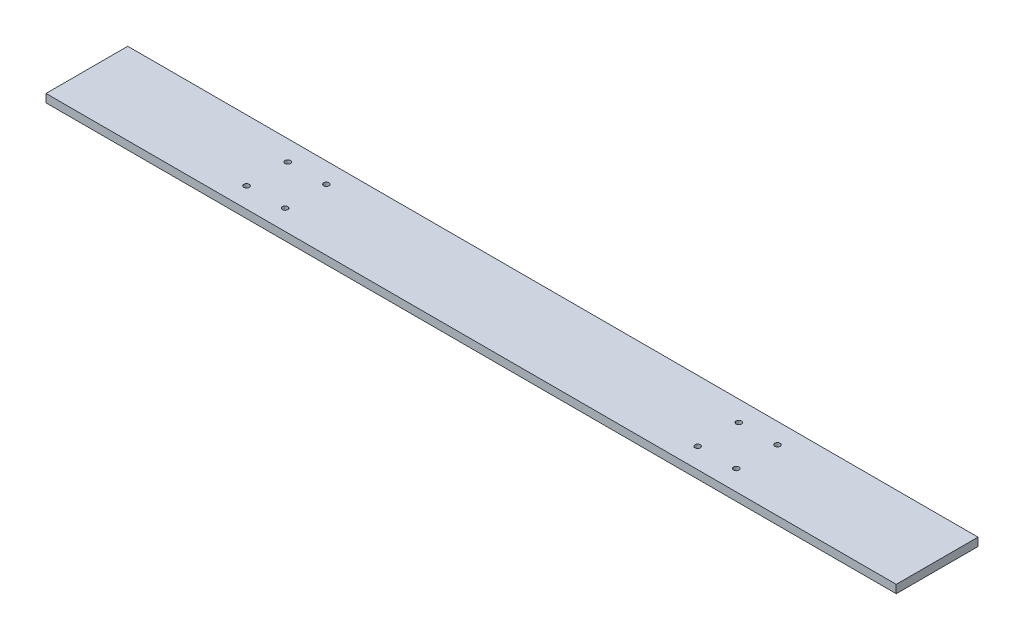
ISO-10303-21;
HEADER;
FILE_DESCRIPTION(('STEP AP214'),'2;1');
FILE_NAME('part.step','',(''),(''),'','','');
FILE_SCHEMA(('AUTOMOTIVE_DESIGN { 1 0 10303 214 1 1 1 1 }'));
ENDSEC;
DATA;
#1=APPLICATION_CONTEXT('core data for automotive mechanical design processes');
#2=APPLICATION_PROTOCOL_DEFINITION('international standard','automotive_design',2000,#1);
#3=PRODUCT_CONTEXT('',#1,'mechanical');
#4=PRODUCT('Part','Part','',(#3));
#5=PRODUCT_RELATED_PRODUCT_CATEGORY('part','',(#4));
#6=PRODUCT_DEFINITION_FORMATION('','',#4);
#7=PRODUCT_DEFINITION_CONTEXT('part definition',#1,'design');
#8=PRODUCT_DEFINITION('design','',#6,#7);
#9=PRODUCT_DEFINITION_SHAPE('','',#8);
#10=(LENGTH_UNIT() NAMED_UNIT(*) SI_UNIT(.MILLI.,.METRE.));
#11=(NAMED_UNIT(*) PLANE_ANGLE_UNIT() SI_UNIT($,.RADIAN.));
#12=(NAMED_UNIT(*) SI_UNIT($,.STERADIAN.) SOLID_ANGLE_UNIT());
#13=UNCERTAINTY_MEASURE_WITH_UNIT(LENGTH_MEASURE(1.E-05),#10,'distance_accuracy_value','');
#14=(GEOMETRIC_REPRESENTATION_CONTEXT(3) GLOBAL_UNCERTAINTY_ASSIGNED_CONTEXT((#13)) GLOBAL_UNIT_ASSIGNED_CONTEXT((#10,
#11,#12)) REPRESENTATION_CONTEXT('',''));
#15=CARTESIAN_POINT('',(0.,0.,0.));
#16=DIRECTION('',(0.,0.,1.));
#17=DIRECTION('',(1.,0.,0.));
#18=AXIS2_PLACEMENT_3D('',#15,#16,#17);
#19=CARTESIAN_POINT('',(655.534455322952,6.35,0.995623632385121));
#20=DIRECTION('',(-1.,0.,0.));
#21=DIRECTION('',(0.,0.,1.));
#22=AXIS2_PLACEMENT_3D('',#19,#20,#21);
#23=PLANE('',#22);
#24=DIRECTION('',(0.,0.,-1.));
#25=VECTOR('',#24,1.);
#26=CARTESIAN_POINT('',(655.534455322952,0.,0.995623632385121));
#27=LINE('',#26,#25);
#28=CARTESIAN_POINT('',(655.534455322952,0.,0.995623632385121));
#29=VERTEX_POINT('',#28);
#30=CARTESIAN_POINT('',(655.534455322952,0.,-62.5043763676149));
#31=VERTEX_POINT('',#30);
#32=EDGE_CURVE('E101',#29,#31,#27,.T.);
#33=ORIENTED_EDGE('',*,*,#32,.T.);
#34=DIRECTION('',(0.,-1.,0.));
#35=VECTOR('',#34,1.);
#36=CARTESIAN_POINT('',(655.534455322952,6.35,-62.5043763676149));
#37=LINE('',#36,#35);
#38=CARTESIAN_POINT('',(655.534455322952,6.35,-62.5043763676149));
#39=VERTEX_POINT('',#38);
#40=EDGE_CURVE('E11',#39,#31,#37,.T.);
#41=ORIENTED_EDGE('',*,*,#40,.F.);
#42=DIRECTION('',(0.,0.,-1.));
#43=VECTOR('',#42,1.);
#44=CARTESIAN_POINT('',(655.534455322952,6.35,0.995623632385121));
#45=LINE('',#44,#43);
#46=CARTESIAN_POINT('',(655.534455322952,6.35,0.995623632385121));
#47=VERTEX_POINT('',#46);
#48=EDGE_CURVE('E89',#47,#39,#45,.T.);
#49=ORIENTED_EDGE('',*,*,#48,.F.);
#50=DIRECTION('',(0.,-1.,0.));
#51=VECTOR('',#50,1.);
#52=CARTESIAN_POINT('',(655.534455322952,6.35,0.995623632385121));
#53=LINE('',#52,#51);
#54=EDGE_CURVE('E97',#47,#29,#53,.T.);
#55=ORIENTED_EDGE('',*,*,#54,.T.);
#56=EDGE_LOOP('',(#33,#41,#49,#55));
#57=FACE_BOUND('',#56,.T.);
#58=ADVANCED_FACE('F38',(#57),#23,.F.);
#59=CARTESIAN_POINT('',(-4.86554467704787,6.35,-62.5043763676149));
#60=DIRECTION('',(0.,0.,1.));
#61=DIRECTION('',(1.,0.,0.));
#62=AXIS2_PLACEMENT_3D('',#59,#60,#61);
#63=PLANE('',#62);
#64=DIRECTION('',(-1.,0.,0.));
#65=VECTOR('',#64,1.);
#66=CARTESIAN_POINT('',(-4.86554467704787,0.,-62.5043763676149));
#67=LINE('',#66,#65);
#68=CARTESIAN_POINT('',(-4.86554467704787,0.,-62.5043763676149));
#69=VERTEX_POINT('',#68);
#70=EDGE_CURVE('E93',#31,#69,#67,.T.);
#71=ORIENTED_EDGE('',*,*,#70,.T.);
#72=DIRECTION('',(0.,-1.,0.));
#73=VECTOR('',#72,1.);
#74=CARTESIAN_POINT('',(-4.86554467704787,6.35,-62.5043763676149));
#75=LINE('',#74,#73);
#76=CARTESIAN_POINT('',(-4.86554467704787,6.35,-62.5043763676149));
#77=VERTEX_POINT('',#76);
#78=EDGE_CURVE('E46',#77,#69,#75,.T.);
#79=ORIENTED_EDGE('',*,*,#78,.F.);
#80=DIRECTION('',(-1.,0.,0.));
#81=VECTOR('',#80,1.);
#82=CARTESIAN_POINT('',(-4.86554467704787,6.35,-62.5043763676149));
#83=LINE('',#82,#81);
#84=EDGE_CURVE('E84',#39,#77,#83,.T.);
#85=ORIENTED_EDGE('',*,*,#84,.F.);
#86=ORIENTED_EDGE('',*,*,#40,.T.);
#87=EDGE_LOOP('',(#71,#79,#85,#86));
#88=FACE_BOUND('',#87,.T.);
#89=ADVANCED_FACE('F92',(#88),#63,.F.);
#90=CARTESIAN_POINT('',(-4.86554467704787,6.35,0.995623632385121));
#91=DIRECTION('',(1.,0.,0.));
#92=DIRECTION('',(0.,0.,-1.));
#93=AXIS2_PLACEMENT_3D('',#90,#91,#92);
#94=PLANE('',#93);
#95=DIRECTION('',(0.,0.,1.));
#96=VECTOR('',#95,1.);
#97=CARTESIAN_POINT('',(-4.86554467704787,0.,0.995623632385121));
#98=LINE('',#97,#96);
#99=CARTESIAN_POINT('',(-4.86554467704787,0.,0.995623632385121));
#100=VERTEX_POINT('',#99);
#101=EDGE_CURVE('E71',#69,#100,#98,.T.);
#102=ORIENTED_EDGE('',*,*,#101,.T.);
#103=DIRECTION('',(0.,-1.,0.));
#104=VECTOR('',#103,1.);
#105=CARTESIAN_POINT('',(-4.86554467704787,6.35,0.995623632385121));
#106=LINE('',#105,#104);
#107=CARTESIAN_POINT('',(-4.86554467704787,6.35,0.995623632385121));
#108=VERTEX_POINT('',#107);
#109=EDGE_CURVE('E94',#108,#100,#106,.T.);
#110=ORIENTED_EDGE('',*,*,#109,.F.);
#111=DIRECTION('',(0.,0.,1.));
#112=VECTOR('',#111,1.);
#113=CARTESIAN_POINT('',(-4.86554467704787,6.35,0.995623632385121));
#114=LINE('',#113,#112);
#115=EDGE_CURVE('E87',#77,#108,#114,.T.);
#116=ORIENTED_EDGE('',*,*,#115,.F.);
#117=ORIENTED_EDGE('',*,*,#78,.T.);
#118=EDGE_LOOP('',(#102,#110,#116,#117));
#119=FACE_BOUND('',#118,.T.);
#120=ADVANCED_FACE('F95',(#119),#94,.F.);
#121=CARTESIAN_POINT('',(-4.86554467704787,6.35,0.995623632385121));
#122=DIRECTION('',(0.,0.,-1.));
#123=DIRECTION('',(-1.,0.,0.));
#124=AXIS2_PLACEMENT_3D('',#121,#122,#123);
#125=PLANE('',#124);
#126=DIRECTION('',(1.,0.,0.));
#127=VECTOR('',#126,1.);
#128=CARTESIAN_POINT('',(-4.86554467704787,0.,0.995623632385121));
#129=LINE('',#128,#127);
#130=EDGE_CURVE('E77',#100,#29,#129,.T.);
#131=ORIENTED_EDGE('',*,*,#130,.T.);
#132=ORIENTED_EDGE('',*,*,#54,.F.);
#133=DIRECTION('',(1.,0.,0.));
#134=VECTOR('',#133,1.);
#135=CARTESIAN_POINT('',(-4.86554467704787,6.35,0.995623632385121));
#136=LINE('',#135,#134);
#137=EDGE_CURVE('E54',#108,#47,#136,.T.);
#138=ORIENTED_EDGE('',*,*,#137,.F.);
#139=ORIENTED_EDGE('',*,*,#109,.T.);
#140=EDGE_LOOP('',(#131,#132,#138,#139));
#141=FACE_BOUND('',#140,.T.);
#142=ADVANCED_FACE('F109',(#141),#125,.F.);
#143=CARTESIAN_POINT('',(0.,6.35,0.));
#144=DIRECTION('',(0.,-1.,0.));
#145=DIRECTION('',(0.,0.,-1.));
#146=AXIS2_PLACEMENT_3D('',#143,#144,#145);
#147=PLANE('',#146);
#148=CARTESIAN_POINT('',(165.134455322952,6.35,-46.7543763676149));
#149=DIRECTION('',(0.,1.,0.));
#150=DIRECTION('',(0.,0.,1.));
#151=AXIS2_PLACEMENT_3D('',#148,#149,#150);
#152=CIRCLE('',#151,2.10000000000005);
#153=CARTESIAN_POINT('',(165.134455322952,6.35,-44.6543763676148));
#154=VERTEX_POINT('',#153);
#155=EDGE_CURVE('E133',#154,#154,#152,.T.);
#156=ORIENTED_EDGE('',*,*,#155,.F.);
#157=EDGE_LOOP('',(#156));
#158=FACE_BOUND('',#157,.T.);
#159=CARTESIAN_POINT('',(485.534455322952,6.35,-14.7543763676149));
#160=DIRECTION('',(0.,1.,0.));
#161=DIRECTION('',(0.,0.,1.));
#162=AXIS2_PLACEMENT_3D('',#159,#160,#161);
#163=CIRCLE('',#162,2.10000000000005);
#164=CARTESIAN_POINT('',(485.534455322952,6.35,-12.6543763676148));
#165=VERTEX_POINT('',#164);
#166=EDGE_CURVE('E140',#165,#165,#163,.T.);
#167=ORIENTED_EDGE('',*,*,#166,.F.);
#168=EDGE_LOOP('',(#167));
#169=FACE_BOUND('',#168,.T.);
#170=CARTESIAN_POINT('',(485.534455322952,6.35,-46.7543763676149));
#171=DIRECTION('',(0.,1.,0.));
#172=DIRECTION('',(0.,0.,1.));
#173=AXIS2_PLACEMENT_3D('',#170,#171,#172);
#174=CIRCLE('',#173,2.10000000000005);
#175=CARTESIAN_POINT('',(485.534455322952,6.35,-44.6543763676148));
#176=VERTEX_POINT('',#175);
#177=EDGE_CURVE('E121',#176,#176,#174,.T.);
#178=ORIENTED_EDGE('',*,*,#177,.F.);
#179=EDGE_LOOP('',(#178));
#180=FACE_BOUND('',#179,.T.);
#181=CARTESIAN_POINT('',(515.534455322952,6.35,-14.7543763676149));
#182=DIRECTION('',(0.,1.,0.));
#183=DIRECTION('',(0.,0.,1.));
#184=AXIS2_PLACEMENT_3D('',#181,#182,#183);
#185=CIRCLE('',#184,2.10000000000005);
#186=CARTESIAN_POINT('',(515.534455322952,6.35,-12.6543763676148));
#187=VERTEX_POINT('',#186);
#188=EDGE_CURVE('E128',#187,#187,#185,.T.);
#189=ORIENTED_EDGE('',*,*,#188,.F.);
#190=EDGE_LOOP('',(#189));
#191=FACE_BOUND('',#190,.T.);
#192=CARTESIAN_POINT('',(135.134455322952,6.35,-14.7543763676149));
#193=DIRECTION('',(0.,1.,0.));
#194=DIRECTION('',(0.,0.,1.));
#195=AXIS2_PLACEMENT_3D('',#192,#193,#194);
#196=CIRCLE('',#195,2.10000000000005);
#197=CARTESIAN_POINT('',(135.134455322952,6.35,-12.6543763676148));
#198=VERTEX_POINT('',#197);
#199=EDGE_CURVE('E157',#198,#198,#196,.T.);
#200=ORIENTED_EDGE('',*,*,#199,.F.);
#201=EDGE_LOOP('',(#200));
#202=FACE_BOUND('',#201,.T.);
#203=CARTESIAN_POINT('',(135.134455322952,6.35,-46.7543763676149));
#204=DIRECTION('',(0.,1.,0.));
#205=DIRECTION('',(0.,0.,1.));
#206=AXIS2_PLACEMENT_3D('',#203,#204,#205);
#207=CIRCLE('',#206,2.10000000000005);
#208=CARTESIAN_POINT('',(135.134455322952,6.35,-44.6543763676148));
#209=VERTEX_POINT('',#208);
#210=EDGE_CURVE('E145',#209,#209,#207,.T.);
#211=ORIENTED_EDGE('',*,*,#210,.F.);
#212=EDGE_LOOP('',(#211));
#213=FACE_BOUND('',#212,.T.);
#214=CARTESIAN_POINT('',(165.134455322952,6.35,-14.7543763676149));
#215=DIRECTION('',(0.,1.,0.));
#216=DIRECTION('',(0.,0.,1.));
#217=AXIS2_PLACEMENT_3D('',#214,#215,#216);
#218=CIRCLE('',#217,2.10000000000005);
#219=CARTESIAN_POINT('',(165.134455322952,6.35,-12.6543763676148));
#220=VERTEX_POINT('',#219);
#221=EDGE_CURVE('E152',#220,#220,#218,.T.);
#222=ORIENTED_EDGE('',*,*,#221,.F.);
#223=EDGE_LOOP('',(#222));
#224=FACE_BOUND('',#223,.T.);
#225=CARTESIAN_POINT('',(515.534455322952,6.35,-46.7543763676149));
#226=DIRECTION('',(0.,1.,0.));
#227=DIRECTION('',(0.,0.,1.));
#228=AXIS2_PLACEMENT_3D('',#225,#226,#227);
#229=CIRCLE('',#228,2.10000000000005);
#230=CARTESIAN_POINT('',(515.534455322952,6.35,-44.6543763676148));
#231=VERTEX_POINT('',#230);
#232=EDGE_CURVE('E115',#231,#231,#229,.T.);
#233=ORIENTED_EDGE('',*,*,#232,.F.);
#234=EDGE_LOOP('',(#233));
#235=FACE_BOUND('',#234,.T.);
#236=ORIENTED_EDGE('',*,*,#48,.T.);
#237=ORIENTED_EDGE('',*,*,#84,.T.);
#238=ORIENTED_EDGE('',*,*,#115,.T.);
#239=ORIENTED_EDGE('',*,*,#137,.T.);
#240=EDGE_LOOP('',(#236,#237,#238,#239));
#241=FACE_BOUND('',#240,.T.);
#242=ADVANCED_FACE('F85',(#158,#169,#180,#191,#202,#213,#224,#235,#241),#147,.F.);
#243=CARTESIAN_POINT('',(0.,0.,0.));
#244=DIRECTION('',(0.,-1.,0.));
#245=DIRECTION('',(0.,0.,-1.));
#246=AXIS2_PLACEMENT_3D('',#243,#244,#245);
#247=PLANE('',#246);
#248=CARTESIAN_POINT('',(165.134455322952,0.,-46.7543763676149));
#249=DIRECTION('',(0.,1.,0.));
#250=DIRECTION('',(0.,0.,1.));
#251=AXIS2_PLACEMENT_3D('',#248,#249,#250);
#252=CIRCLE('',#251,2.10000000000005);
#253=CARTESIAN_POINT('',(165.134455322952,0.,-44.6543763676148));
#254=VERTEX_POINT('',#253);
#255=EDGE_CURVE('E136',#254,#254,#252,.T.);
#256=ORIENTED_EDGE('',*,*,#255,.T.);
#257=EDGE_LOOP('',(#256));
#258=FACE_BOUND('',#257,.T.);
#259=CARTESIAN_POINT('',(485.534455322952,0.,-14.7543763676149));
#260=DIRECTION('',(0.,1.,0.));
#261=DIRECTION('',(0.,0.,1.));
#262=AXIS2_PLACEMENT_3D('',#259,#260,#261);
#263=CIRCLE('',#262,2.10000000000005);
#264=CARTESIAN_POINT('',(485.534455322952,0.,-12.6543763676148));
#265=VERTEX_POINT('',#264);
#266=EDGE_CURVE('E125',#265,#265,#263,.T.);
#267=ORIENTED_EDGE('',*,*,#266,.T.);
#268=EDGE_LOOP('',(#267));
#269=FACE_BOUND('',#268,.T.);
#270=CARTESIAN_POINT('',(485.534455322952,0.,-46.7543763676149));
#271=DIRECTION('',(0.,1.,0.));
#272=DIRECTION('',(0.,0.,1.));
#273=AXIS2_PLACEMENT_3D('',#270,#271,#272);
#274=CIRCLE('',#273,2.10000000000005);
#275=CARTESIAN_POINT('',(485.534455322952,0.,-44.6543763676148));
#276=VERTEX_POINT('',#275);
#277=EDGE_CURVE('E124',#276,#276,#274,.T.);
#278=ORIENTED_EDGE('',*,*,#277,.T.);
#279=EDGE_LOOP('',(#278));
#280=FACE_BOUND('',#279,.T.);
#281=CARTESIAN_POINT('',(515.534455322952,0.,-14.7543763676149));
#282=DIRECTION('',(0.,1.,0.));
#283=DIRECTION('',(0.,0.,1.));
#284=AXIS2_PLACEMENT_3D('',#281,#282,#283);
#285=CIRCLE('',#284,2.10000000000005);
#286=CARTESIAN_POINT('',(515.534455322952,0.,-12.6543763676148));
#287=VERTEX_POINT('',#286);
#288=EDGE_CURVE('E118',#287,#287,#285,.T.);
#289=ORIENTED_EDGE('',*,*,#288,.T.);
#290=EDGE_LOOP('',(#289));
#291=FACE_BOUND('',#290,.T.);
#292=CARTESIAN_POINT('',(135.134455322952,0.,-14.7543763676149));
#293=DIRECTION('',(0.,1.,0.));
#294=DIRECTION('',(0.,0.,1.));
#295=AXIS2_PLACEMENT_3D('',#292,#293,#294);
#296=CIRCLE('',#295,2.10000000000005);
#297=CARTESIAN_POINT('',(135.134455322952,0.,-12.6543763676148));
#298=VERTEX_POINT('',#297);
#299=EDGE_CURVE('E149',#298,#298,#296,.T.);
#300=ORIENTED_EDGE('',*,*,#299,.T.);
#301=EDGE_LOOP('',(#300));
#302=FACE_BOUND('',#301,.T.);
#303=CARTESIAN_POINT('',(135.134455322952,0.,-46.7543763676149));
#304=DIRECTION('',(0.,1.,0.));
#305=DIRECTION('',(0.,0.,1.));
#306=AXIS2_PLACEMENT_3D('',#303,#304,#305);
#307=CIRCLE('',#306,2.10000000000005);
#308=CARTESIAN_POINT('',(135.134455322952,0.,-44.6543763676148));
#309=VERTEX_POINT('',#308);
#310=EDGE_CURVE('E148',#309,#309,#307,.T.);
#311=ORIENTED_EDGE('',*,*,#310,.T.);
#312=EDGE_LOOP('',(#311));
#313=FACE_BOUND('',#312,.T.);
#314=CARTESIAN_POINT('',(165.134455322952,0.,-14.7543763676149));
#315=DIRECTION('',(0.,1.,0.));
#316=DIRECTION('',(0.,0.,1.));
#317=AXIS2_PLACEMENT_3D('',#314,#315,#316);
#318=CIRCLE('',#317,2.10000000000005);
#319=CARTESIAN_POINT('',(165.134455322952,0.,-12.6543763676148));
#320=VERTEX_POINT('',#319);
#321=EDGE_CURVE('E137',#320,#320,#318,.T.);
#322=ORIENTED_EDGE('',*,*,#321,.T.);
#323=EDGE_LOOP('',(#322));
#324=FACE_BOUND('',#323,.T.);
#325=CARTESIAN_POINT('',(515.534455322952,0.,-46.7543763676149));
#326=DIRECTION('',(0.,1.,0.));
#327=DIRECTION('',(0.,0.,1.));
#328=AXIS2_PLACEMENT_3D('',#325,#326,#327);
#329=CIRCLE('',#328,2.10000000000005);
#330=CARTESIAN_POINT('',(515.534455322952,0.,-44.6543763676148));
#331=VERTEX_POINT('',#330);
#332=EDGE_CURVE('E104',#331,#331,#329,.T.);
#333=ORIENTED_EDGE('',*,*,#332,.T.);
#334=EDGE_LOOP('',(#333));
#335=FACE_BOUND('',#334,.T.);
#336=ORIENTED_EDGE('',*,*,#32,.F.);
#337=ORIENTED_EDGE('',*,*,#130,.F.);
#338=ORIENTED_EDGE('',*,*,#101,.F.);
#339=ORIENTED_EDGE('',*,*,#70,.F.);
#340=EDGE_LOOP('',(#336,#337,#338,#339));
#341=FACE_BOUND('',#340,.T.);
#342=ADVANCED_FACE('F112',(#258,#269,#280,#291,#302,#313,#324,#335,#341),#247,.T.);
#343=CARTESIAN_POINT('',(515.534455322952,0.,-46.7543763676149));
#344=DIRECTION('',(0.,1.,0.));
#345=DIRECTION('',(0.,0.,1.));
#346=AXIS2_PLACEMENT_3D('',#343,#344,#345);
#347=CYLINDRICAL_SURFACE('',#346,2.10000000000005);
#348=ORIENTED_EDGE('',*,*,#332,.F.);
#349=EDGE_LOOP('',(#348));
#350=FACE_BOUND('',#349,.T.);
#351=ORIENTED_EDGE('',*,*,#232,.T.);
#352=EDGE_LOOP('',(#351));
#353=FACE_BOUND('',#352,.T.);
#354=ADVANCED_FACE('F183',(#350,#353),#347,.F.);
#355=CARTESIAN_POINT('',(165.134455322952,0.,-14.7543763676149));
#356=DIRECTION('',(0.,1.,0.));
#357=DIRECTION('',(0.,0.,1.));
#358=AXIS2_PLACEMENT_3D('',#355,#356,#357);
#359=CYLINDRICAL_SURFACE('',#358,2.10000000000005);
#360=ORIENTED_EDGE('',*,*,#321,.F.);
#361=EDGE_LOOP('',(#360));
#362=FACE_BOUND('',#361,.T.);
#363=ORIENTED_EDGE('',*,*,#221,.T.);
#364=EDGE_LOOP('',(#363));
#365=FACE_BOUND('',#364,.T.);
#366=ADVANCED_FACE('F185',(#362,#365),#359,.F.);
#367=CARTESIAN_POINT('',(135.134455322952,0.,-46.7543763676149));
#368=DIRECTION('',(0.,1.,0.));
#369=DIRECTION('',(0.,0.,1.));
#370=AXIS2_PLACEMENT_3D('',#367,#368,#369);
#371=CYLINDRICAL_SURFACE('',#370,2.10000000000005);
#372=ORIENTED_EDGE('',*,*,#310,.F.);
#373=EDGE_LOOP('',(#372));
#374=FACE_BOUND('',#373,.T.);
#375=ORIENTED_EDGE('',*,*,#210,.T.);
#376=EDGE_LOOP('',(#375));
#377=FACE_BOUND('',#376,.T.);
#378=ADVANCED_FACE('F169',(#374,#377),#371,.F.);
#379=CARTESIAN_POINT('',(135.134455322952,0.,-14.7543763676149));
#380=DIRECTION('',(0.,1.,0.));
#381=DIRECTION('',(0.,0.,1.));
#382=AXIS2_PLACEMENT_3D('',#379,#380,#381);
#383=CYLINDRICAL_SURFACE('',#382,2.10000000000005);
#384=ORIENTED_EDGE('',*,*,#299,.F.);
#385=EDGE_LOOP('',(#384));
#386=FACE_BOUND('',#385,.T.);
#387=ORIENTED_EDGE('',*,*,#199,.T.);
#388=EDGE_LOOP('',(#387));
#389=FACE_BOUND('',#388,.T.);
#390=ADVANCED_FACE('F165',(#386,#389),#383,.F.);
#391=CARTESIAN_POINT('',(515.534455322952,0.,-14.7543763676149));
#392=DIRECTION('',(0.,1.,0.));
#393=DIRECTION('',(0.,0.,1.));
#394=AXIS2_PLACEMENT_3D('',#391,#392,#393);
#395=CYLINDRICAL_SURFACE('',#394,2.10000000000005);
#396=ORIENTED_EDGE('',*,*,#288,.F.);
#397=EDGE_LOOP('',(#396));
#398=FACE_BOUND('',#397,.T.);
#399=ORIENTED_EDGE('',*,*,#188,.T.);
#400=EDGE_LOOP('',(#399));
#401=FACE_BOUND('',#400,.T.);
#402=ADVANCED_FACE('F168',(#398,#401),#395,.F.);
#403=CARTESIAN_POINT('',(485.534455322952,0.,-46.7543763676149));
#404=DIRECTION('',(0.,1.,0.));
#405=DIRECTION('',(0.,0.,1.));
#406=AXIS2_PLACEMENT_3D('',#403,#404,#405);
#407=CYLINDRICAL_SURFACE('',#406,2.10000000000005);
#408=ORIENTED_EDGE('',*,*,#277,.F.);
#409=EDGE_LOOP('',(#408));
#410=FACE_BOUND('',#409,.T.);
#411=ORIENTED_EDGE('',*,*,#177,.T.);
#412=EDGE_LOOP('',(#411));
#413=FACE_BOUND('',#412,.T.);
#414=ADVANCED_FACE('F256',(#410,#413),#407,.F.);
#415=CARTESIAN_POINT('',(485.534455322952,0.,-14.7543763676149));
#416=DIRECTION('',(0.,1.,0.));
#417=DIRECTION('',(0.,0.,1.));
#418=AXIS2_PLACEMENT_3D('',#415,#416,#417);
#419=CYLINDRICAL_SURFACE('',#418,2.10000000000005);
#420=ORIENTED_EDGE('',*,*,#266,.F.);
#421=EDGE_LOOP('',(#420));
#422=FACE_BOUND('',#421,.T.);
#423=ORIENTED_EDGE('',*,*,#166,.T.);
#424=EDGE_LOOP('',(#423));
#425=FACE_BOUND('',#424,.T.);
#426=ADVANCED_FACE('F266',(#422,#425),#419,.F.);
#427=CARTESIAN_POINT('',(165.134455322952,0.,-46.7543763676149));
#428=DIRECTION('',(0.,1.,0.));
#429=DIRECTION('',(0.,0.,1.));
#430=AXIS2_PLACEMENT_3D('',#427,#428,#429);
#431=CYLINDRICAL_SURFACE('',#430,2.10000000000005);
#432=ORIENTED_EDGE('',*,*,#255,.F.);
#433=EDGE_LOOP('',(#432));
#434=FACE_BOUND('',#433,.T.);
#435=ORIENTED_EDGE('',*,*,#155,.T.);
#436=EDGE_LOOP('',(#435));
#437=FACE_BOUND('',#436,.T.);
#438=ADVANCED_FACE('F275',(#434,#437),#431,.F.);
#439=CLOSED_SHELL('',(#58,#89,#120,#142,#242,#342,#354,#366,#378,#390,#402,#414,#426,#438));
#440=MANIFOLD_SOLID_BREP('B2',#439);
#441=ADVANCED_BREP_SHAPE_REPRESENTATION('',(#18,#440),#14);
#442=SHAPE_DEFINITION_REPRESENTATION(#9,#441);
ENDSEC;
END-ISO-10303-21;
